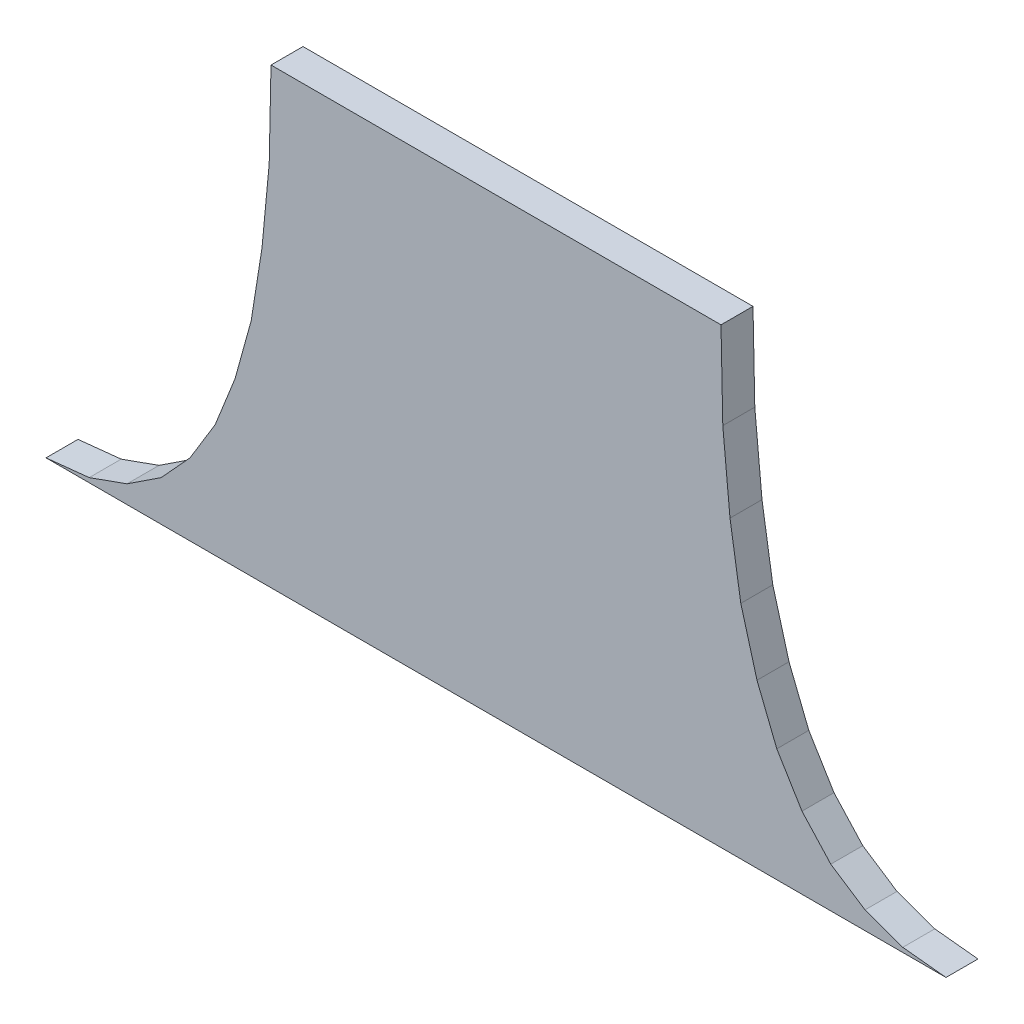
ISO-10303-21;
HEADER;
FILE_DESCRIPTION(('STEP AP214'),'2;1');
FILE_NAME('part.step','',(''),(''),'','','');
FILE_SCHEMA(('AUTOMOTIVE_DESIGN { 1 0 10303 214 1 1 1 1 }'));
ENDSEC;
DATA;
#1=APPLICATION_CONTEXT('core data for automotive mechanical design processes');
#2=APPLICATION_PROTOCOL_DEFINITION('international standard','automotive_design',2000,#1);
#3=PRODUCT_CONTEXT('',#1,'mechanical');
#4=PRODUCT('Part','Part','',(#3));
#5=PRODUCT_RELATED_PRODUCT_CATEGORY('part','',(#4));
#6=PRODUCT_DEFINITION_FORMATION('','',#4);
#7=PRODUCT_DEFINITION_CONTEXT('part definition',#1,'design');
#8=PRODUCT_DEFINITION('design','',#6,#7);
#9=PRODUCT_DEFINITION_SHAPE('','',#8);
#10=(LENGTH_UNIT() NAMED_UNIT(*) SI_UNIT(.MILLI.,.METRE.));
#11=(NAMED_UNIT(*) PLANE_ANGLE_UNIT() SI_UNIT($,.RADIAN.));
#12=(NAMED_UNIT(*) SI_UNIT($,.STERADIAN.) SOLID_ANGLE_UNIT());
#13=UNCERTAINTY_MEASURE_WITH_UNIT(LENGTH_MEASURE(1.E-05),#10,'distance_accuracy_value','');
#14=(GEOMETRIC_REPRESENTATION_CONTEXT(3) GLOBAL_UNCERTAINTY_ASSIGNED_CONTEXT((#13)) GLOBAL_UNIT_ASSIGNED_CONTEXT((#10,
#11,#12)) REPRESENTATION_CONTEXT('',''));
#15=CARTESIAN_POINT('',(0.,0.,0.));
#16=DIRECTION('',(0.,0.,1.));
#17=DIRECTION('',(1.,0.,0.));
#18=AXIS2_PLACEMENT_3D('',#15,#16,#17);
#19=CARTESIAN_POINT('',(33.6500015258789,102.387001037598,0.));
#20=DIRECTION('',(0.999782470330141,-0.0208569417834906,0.));
#21=DIRECTION('',(-0.0208569417834906,-0.999782470330141,0.));
#22=AXIS2_PLACEMENT_3D('',#19,#20,#21);
#23=PLANE('',#22);
#24=DIRECTION('',(-0.0208569417834906,-0.999782470330141,0.));
#25=VECTOR('',#24,1.);
#26=CARTESIAN_POINT('',(33.6500015258789,102.387001037598,0.03556));
#27=LINE('',#26,#25);
#28=CARTESIAN_POINT('',(33.6500015258789,102.387001037598,0.03556));
#29=VERTEX_POINT('',#28);
#30=CARTESIAN_POINT('',(33.6479988098145,102.291000366211,0.03556));
#31=VERTEX_POINT('',#30);
#32=EDGE_CURVE('E11',#29,#31,#27,.T.);
#33=ORIENTED_EDGE('',*,*,#32,.F.);
#34=DIRECTION('',(0.,0.,1.));
#35=VECTOR('',#34,1.);
#36=CARTESIAN_POINT('',(33.6500015258789,102.387001037598,0.));
#37=LINE('',#36,#35);
#38=CARTESIAN_POINT('',(33.6500015258789,102.387001037598,0.));
#39=VERTEX_POINT('',#38);
#40=EDGE_CURVE('E24',#39,#29,#37,.T.);
#41=ORIENTED_EDGE('',*,*,#40,.F.);
#42=DIRECTION('',(-0.0208569417834906,-0.999782470330141,0.));
#43=VECTOR('',#42,1.);
#44=CARTESIAN_POINT('',(33.6500015258789,102.387001037598,0.));
#45=LINE('',#44,#43);
#46=CARTESIAN_POINT('',(33.6479988098145,102.291000366211,0.));
#47=VERTEX_POINT('',#46);
#48=EDGE_CURVE('E184',#39,#47,#45,.T.);
#49=ORIENTED_EDGE('',*,*,#48,.T.);
#50=DIRECTION('',(0.,0.,1.));
#51=VECTOR('',#50,1.);
#52=CARTESIAN_POINT('',(33.6479988098145,102.291000366211,0.));
#53=LINE('',#52,#51);
#54=EDGE_CURVE('E37',#47,#31,#53,.T.);
#55=ORIENTED_EDGE('',*,*,#54,.T.);
#56=EDGE_LOOP('',(#33,#41,#49,#55));
#57=FACE_BOUND('',#56,.T.);
#58=ADVANCED_FACE('F17',(#57),#23,.F.);
#59=CARTESIAN_POINT('',(33.6479988098145,102.291000366211,0.));
#60=DIRECTION('',(0.995600683079774,-0.0936978113463013,0.));
#61=DIRECTION('',(-0.0936978113463013,-0.995600683079774,0.));
#62=AXIS2_PLACEMENT_3D('',#59,#60,#61);
#63=PLANE('',#62);
#64=DIRECTION('',(-0.0936978113463013,-0.995600683079774,0.));
#65=VECTOR('',#64,1.);
#66=CARTESIAN_POINT('',(33.6479988098145,102.291000366211,0.03556));
#67=LINE('',#66,#65);
#68=CARTESIAN_POINT('',(33.6399993896484,102.206001281738,0.03556));
#69=VERTEX_POINT('',#68);
#70=EDGE_CURVE('E336',#31,#69,#67,.T.);
#71=ORIENTED_EDGE('',*,*,#70,.F.);
#72=ORIENTED_EDGE('',*,*,#54,.F.);
#73=DIRECTION('',(-0.0936978113463013,-0.995600683079774,0.));
#74=VECTOR('',#73,1.);
#75=CARTESIAN_POINT('',(33.6479988098145,102.291000366211,0.));
#76=LINE('',#75,#74);
#77=CARTESIAN_POINT('',(33.6399993896484,102.206001281738,0.));
#78=VERTEX_POINT('',#77);
#79=EDGE_CURVE('E333',#47,#78,#76,.T.);
#80=ORIENTED_EDGE('',*,*,#79,.T.);
#81=DIRECTION('',(0.,0.,1.));
#82=VECTOR('',#81,1.);
#83=CARTESIAN_POINT('',(33.6399993896484,102.206001281738,0.));
#84=LINE('',#83,#82);
#85=EDGE_CURVE('E331',#78,#69,#84,.T.);
#86=ORIENTED_EDGE('',*,*,#85,.T.);
#87=EDGE_LOOP('',(#71,#72,#80,#86));
#88=FACE_BOUND('',#87,.T.);
#89=ADVANCED_FACE('F344',(#88),#63,.F.);
#90=CARTESIAN_POINT('',(33.6399993896484,102.206001281738,0.));
#91=DIRECTION('',(0.987762161372723,-0.155967665111353,0.));
#92=DIRECTION('',(-0.155967665111353,-0.987762161372723,0.));
#93=AXIS2_PLACEMENT_3D('',#90,#91,#92);
#94=PLANE('',#93);
#95=DIRECTION('',(-0.155967665111353,-0.987762161372723,0.));
#96=VECTOR('',#95,1.);
#97=CARTESIAN_POINT('',(33.6399993896484,102.206001281738,0.03556));
#98=LINE('',#97,#96);
#99=CARTESIAN_POINT('',(33.6279983520508,102.129997253418,0.03556));
#100=VERTEX_POINT('',#99);
#101=EDGE_CURVE('E328',#69,#100,#98,.T.);
#102=ORIENTED_EDGE('',*,*,#101,.F.);
#103=ORIENTED_EDGE('',*,*,#85,.F.);
#104=DIRECTION('',(-0.155967665111353,-0.987762161372723,0.));
#105=VECTOR('',#104,1.);
#106=CARTESIAN_POINT('',(33.6399993896484,102.206001281738,0.));
#107=LINE('',#106,#105);
#108=CARTESIAN_POINT('',(33.6279983520508,102.129997253418,0.));
#109=VERTEX_POINT('',#108);
#110=EDGE_CURVE('E325',#78,#109,#107,.T.);
#111=ORIENTED_EDGE('',*,*,#110,.T.);
#112=DIRECTION('',(0.,0.,1.));
#113=VECTOR('',#112,1.);
#114=CARTESIAN_POINT('',(33.6279983520508,102.129997253418,0.));
#115=LINE('',#114,#113);
#116=EDGE_CURVE('E323',#109,#100,#115,.T.);
#117=ORIENTED_EDGE('',*,*,#116,.T.);
#118=EDGE_LOOP('',(#102,#103,#111,#117));
#119=FACE_BOUND('',#118,.T.);
#120=ADVANCED_FACE('F350',(#119),#94,.F.);
#121=CARTESIAN_POINT('',(33.6279983520508,102.129997253418,0.));
#122=DIRECTION('',(0.963733155260729,-0.266867767726266,0.));
#123=DIRECTION('',(-0.266867767726266,-0.963733155260729,0.));
#124=AXIS2_PLACEMENT_3D('',#121,#122,#123);
#125=PLANE('',#124);
#126=DIRECTION('',(-0.266867767726266,-0.963733155260729,0.));
#127=VECTOR('',#126,1.);
#128=CARTESIAN_POINT('',(33.6279983520508,102.129997253418,0.03556));
#129=LINE('',#128,#127);
#130=CARTESIAN_POINT('',(33.6100006103516,102.065002441406,0.03556));
#131=VERTEX_POINT('',#130);
#132=EDGE_CURVE('E320',#100,#131,#129,.T.);
#133=ORIENTED_EDGE('',*,*,#132,.F.);
#134=ORIENTED_EDGE('',*,*,#116,.F.);
#135=DIRECTION('',(-0.266867767726266,-0.963733155260729,0.));
#136=VECTOR('',#135,1.);
#137=CARTESIAN_POINT('',(33.6279983520508,102.129997253418,0.));
#138=LINE('',#137,#136);
#139=CARTESIAN_POINT('',(33.6100006103516,102.065002441406,0.));
#140=VERTEX_POINT('',#139);
#141=EDGE_CURVE('E317',#109,#140,#138,.T.);
#142=ORIENTED_EDGE('',*,*,#141,.T.);
#143=DIRECTION('',(0.,0.,1.));
#144=VECTOR('',#143,1.);
#145=CARTESIAN_POINT('',(33.6100006103516,102.065002441406,0.));
#146=LINE('',#145,#144);
#147=EDGE_CURVE('E315',#140,#131,#146,.T.);
#148=ORIENTED_EDGE('',*,*,#147,.T.);
#149=EDGE_LOOP('',(#133,#134,#142,#148));
#150=FACE_BOUND('',#149,.T.);
#151=ADVANCED_FACE('F352',(#150),#125,.F.);
#152=CARTESIAN_POINT('',(33.6100006103516,102.065002441406,0.));
#153=DIRECTION('',(0.928481132016093,-0.371379573334499,0.));
#154=DIRECTION('',(-0.371379573334499,-0.928481132016093,0.));
#155=AXIS2_PLACEMENT_3D('',#152,#153,#154);
#156=PLANE('',#155);
#157=DIRECTION('',(-0.371379573334499,-0.928481132016093,0.));
#158=VECTOR('',#157,1.);
#159=CARTESIAN_POINT('',(33.6100006103516,102.065002441406,0.03556));
#160=LINE('',#159,#158);
#161=CARTESIAN_POINT('',(33.5880012512207,102.01000213623,0.03556));
#162=VERTEX_POINT('',#161);
#163=EDGE_CURVE('E312',#131,#162,#160,.T.);
#164=ORIENTED_EDGE('',*,*,#163,.F.);
#165=ORIENTED_EDGE('',*,*,#147,.F.);
#166=DIRECTION('',(-0.371379573334499,-0.928481132016093,0.));
#167=VECTOR('',#166,1.);
#168=CARTESIAN_POINT('',(33.6100006103516,102.065002441406,0.));
#169=LINE('',#168,#167);
#170=CARTESIAN_POINT('',(33.5880012512207,102.01000213623,0.));
#171=VERTEX_POINT('',#170);
#172=EDGE_CURVE('E309',#140,#171,#169,.T.);
#173=ORIENTED_EDGE('',*,*,#172,.T.);
#174=DIRECTION('',(0.,0.,1.));
#175=VECTOR('',#174,1.);
#176=CARTESIAN_POINT('',(33.5880012512207,102.01000213623,0.));
#177=LINE('',#176,#175);
#178=EDGE_CURVE('E307',#171,#162,#177,.T.);
#179=ORIENTED_EDGE('',*,*,#178,.T.);
#180=EDGE_LOOP('',(#164,#165,#173,#179));
#181=FACE_BOUND('',#180,.T.);
#182=ADVANCED_FACE('F357',(#181),#156,.F.);
#183=CARTESIAN_POINT('',(33.5880012512207,102.01000213623,0.));
#184=DIRECTION('',(0.854225909982595,-0.51990200491478,0.));
#185=DIRECTION('',(-0.51990200491478,-0.854225909982595,0.));
#186=AXIS2_PLACEMENT_3D('',#183,#184,#185);
#187=PLANE('',#186);
#188=DIRECTION('',(-0.51990200491478,-0.854225909982595,0.));
#189=VECTOR('',#188,1.);
#190=CARTESIAN_POINT('',(33.5880012512207,102.01000213623,0.03556));
#191=LINE('',#190,#189);
#192=CARTESIAN_POINT('',(33.560001373291,101.963996887207,0.03556));
#193=VERTEX_POINT('',#192);
#194=EDGE_CURVE('E304',#162,#193,#191,.T.);
#195=ORIENTED_EDGE('',*,*,#194,.F.);
#196=ORIENTED_EDGE('',*,*,#178,.F.);
#197=DIRECTION('',(-0.51990200491478,-0.854225909982595,0.));
#198=VECTOR('',#197,1.);
#199=CARTESIAN_POINT('',(33.5880012512207,102.01000213623,0.));
#200=LINE('',#199,#198);
#201=CARTESIAN_POINT('',(33.560001373291,101.963996887207,0.));
#202=VERTEX_POINT('',#201);
#203=EDGE_CURVE('E301',#171,#202,#200,.T.);
#204=ORIENTED_EDGE('',*,*,#203,.T.);
#205=DIRECTION('',(0.,0.,1.));
#206=VECTOR('',#205,1.);
#207=CARTESIAN_POINT('',(33.560001373291,101.963996887207,0.));
#208=LINE('',#207,#206);
#209=EDGE_CURVE('E299',#202,#193,#208,.T.);
#210=ORIENTED_EDGE('',*,*,#209,.T.);
#211=EDGE_LOOP('',(#195,#196,#204,#210));
#212=FACE_BOUND('',#211,.T.);
#213=ADVANCED_FACE('F360',(#212),#187,.F.);
#214=CARTESIAN_POINT('',(33.560001373291,101.963996887207,0.));
#215=DIRECTION('',(0.737975014732249,-0.674828035599394,0.));
#216=DIRECTION('',(-0.674828035599394,-0.737975014732249,0.));
#217=AXIS2_PLACEMENT_3D('',#214,#215,#216);
#218=PLANE('',#217);
#219=DIRECTION('',(-0.674828035599394,-0.737975014732249,0.));
#220=VECTOR('',#219,1.);
#221=CARTESIAN_POINT('',(33.560001373291,101.963996887207,0.03556));
#222=LINE('',#221,#220);
#223=CARTESIAN_POINT('',(33.5279998779297,101.929000854492,0.03556));
#224=VERTEX_POINT('',#223);
#225=EDGE_CURVE('E296',#193,#224,#222,.T.);
#226=ORIENTED_EDGE('',*,*,#225,.F.);
#227=ORIENTED_EDGE('',*,*,#209,.F.);
#228=DIRECTION('',(-0.674828035599394,-0.737975014732249,0.));
#229=VECTOR('',#228,1.);
#230=CARTESIAN_POINT('',(33.560001373291,101.963996887207,0.));
#231=LINE('',#230,#229);
#232=CARTESIAN_POINT('',(33.5279998779297,101.929000854492,0.));
#233=VERTEX_POINT('',#232);
#234=EDGE_CURVE('E293',#202,#233,#231,.T.);
#235=ORIENTED_EDGE('',*,*,#234,.T.);
#236=DIRECTION('',(0.,0.,1.));
#237=VECTOR('',#236,1.);
#238=CARTESIAN_POINT('',(33.5279998779297,101.929000854492,0.));
#239=LINE('',#238,#237);
#240=EDGE_CURVE('E291',#233,#224,#239,.T.);
#241=ORIENTED_EDGE('',*,*,#240,.T.);
#242=EDGE_LOOP('',(#226,#227,#235,#241));
#243=FACE_BOUND('',#242,.T.);
#244=ADVANCED_FACE('F365',(#243),#218,.F.);
#245=CARTESIAN_POINT('',(33.5279998779297,101.929000854492,0.));
#246=DIRECTION('',(0.549658089276112,-0.83538972036609,0.));
#247=DIRECTION('',(-0.83538972036609,-0.549658089276112,0.));
#248=AXIS2_PLACEMENT_3D('',#245,#246,#247);
#249=PLANE('',#248);
#250=DIRECTION('',(-0.83538972036609,-0.549658089276112,0.));
#251=VECTOR('',#250,1.);
#252=CARTESIAN_POINT('',(33.5279998779297,101.929000854492,0.03556));
#253=LINE('',#252,#251);
#254=CARTESIAN_POINT('',(33.4900016784668,101.903999328613,0.03556));
#255=VERTEX_POINT('',#254);
#256=EDGE_CURVE('E288',#224,#255,#253,.T.);
#257=ORIENTED_EDGE('',*,*,#256,.F.);
#258=ORIENTED_EDGE('',*,*,#240,.F.);
#259=DIRECTION('',(-0.83538972036609,-0.549658089276112,0.));
#260=VECTOR('',#259,1.);
#261=CARTESIAN_POINT('',(33.5279998779297,101.929000854492,0.));
#262=LINE('',#261,#260);
#263=CARTESIAN_POINT('',(33.4900016784668,101.903999328613,0.));
#264=VERTEX_POINT('',#263);
#265=EDGE_CURVE('E285',#233,#264,#262,.T.);
#266=ORIENTED_EDGE('',*,*,#265,.T.);
#267=DIRECTION('',(0.,0.,1.));
#268=VECTOR('',#267,1.);
#269=CARTESIAN_POINT('',(33.4900016784668,101.903999328613,0.));
#270=LINE('',#269,#268);
#271=EDGE_CURVE('E283',#264,#255,#270,.T.);
#272=ORIENTED_EDGE('',*,*,#271,.T.);
#273=EDGE_LOOP('',(#257,#258,#266,#272));
#274=FACE_BOUND('',#273,.T.);
#275=ADVANCED_FACE('F368',(#274),#249,.F.);
#276=CARTESIAN_POINT('',(33.4900016784668,101.903999328613,0.));
#277=DIRECTION('',(0.336325559899805,-0.941745781916799,0.));
#278=DIRECTION('',(-0.941745781916799,-0.336325559899805,0.));
#279=AXIS2_PLACEMENT_3D('',#276,#277,#278);
#280=PLANE('',#279);
#281=DIRECTION('',(-0.941745781916799,-0.336325559899805,0.));
#282=VECTOR('',#281,1.);
#283=CARTESIAN_POINT('',(33.4900016784668,101.903999328613,0.03556));
#284=LINE('',#283,#282);
#285=CARTESIAN_POINT('',(33.4480018615723,101.888999938965,0.03556));
#286=VERTEX_POINT('',#285);
#287=EDGE_CURVE('E280',#255,#286,#284,.T.);
#288=ORIENTED_EDGE('',*,*,#287,.F.);
#289=ORIENTED_EDGE('',*,*,#271,.F.);
#290=DIRECTION('',(-0.941745781916799,-0.336325559899805,0.));
#291=VECTOR('',#290,1.);
#292=CARTESIAN_POINT('',(33.4900016784668,101.903999328613,0.));
#293=LINE('',#292,#291);
#294=CARTESIAN_POINT('',(33.4480018615723,101.888999938965,0.));
#295=VERTEX_POINT('',#294);
#296=EDGE_CURVE('E277',#264,#295,#293,.T.);
#297=ORIENTED_EDGE('',*,*,#296,.T.);
#298=DIRECTION('',(0.,0.,1.));
#299=VECTOR('',#298,1.);
#300=CARTESIAN_POINT('',(33.4480018615723,101.888999938965,0.));
#301=LINE('',#300,#299);
#302=EDGE_CURVE('E275',#295,#286,#301,.T.);
#303=ORIENTED_EDGE('',*,*,#302,.T.);
#304=EDGE_LOOP('',(#288,#289,#297,#303));
#305=FACE_BOUND('',#304,.T.);
#306=ADVANCED_FACE('F373',(#305),#280,.F.);
#307=CARTESIAN_POINT('',(33.4480018615723,101.888999938965,0.));
#308=DIRECTION('',(0.103549065734372,-0.994624346668399,0.));
#309=DIRECTION('',(-0.994624346668399,-0.103549065734372,0.));
#310=AXIS2_PLACEMENT_3D('',#307,#308,#309);
#311=PLANE('',#310);
#312=DIRECTION('',(-0.994624346668399,-0.103549065734372,0.));
#313=VECTOR('',#312,1.);
#314=CARTESIAN_POINT('',(33.4480018615723,101.888999938965,0.03556));
#315=LINE('',#314,#313);
#316=CARTESIAN_POINT('',(33.4000015258789,101.884002685547,0.03556));
#317=VERTEX_POINT('',#316);
#318=EDGE_CURVE('E272',#286,#317,#315,.T.);
#319=ORIENTED_EDGE('',*,*,#318,.F.);
#320=ORIENTED_EDGE('',*,*,#302,.F.);
#321=DIRECTION('',(-0.994624346668399,-0.103549065734372,0.));
#322=VECTOR('',#321,1.);
#323=CARTESIAN_POINT('',(33.4480018615723,101.888999938965,0.));
#324=LINE('',#323,#322);
#325=CARTESIAN_POINT('',(33.4000015258789,101.884002685547,0.));
#326=VERTEX_POINT('',#325);
#327=EDGE_CURVE('E269',#295,#326,#324,.T.);
#328=ORIENTED_EDGE('',*,*,#327,.T.);
#329=DIRECTION('',(0.,0.,1.));
#330=VECTOR('',#329,1.);
#331=CARTESIAN_POINT('',(33.4000015258789,101.884002685547,0.));
#332=LINE('',#331,#330);
#333=EDGE_CURVE('E267',#326,#317,#332,.T.);
#334=ORIENTED_EDGE('',*,*,#333,.T.);
#335=EDGE_LOOP('',(#319,#320,#328,#334));
#336=FACE_BOUND('',#335,.T.);
#337=ADVANCED_FACE('F376',(#336),#311,.F.);
#338=CARTESIAN_POINT('',(33.4000015258789,101.884002685547,0.));
#339=DIRECTION('',(0.,1.,0.));
#340=DIRECTION('',(1.,0.,0.));
#341=AXIS2_PLACEMENT_3D('',#338,#339,#340);
#342=PLANE('',#341);
#343=DIRECTION('',(1.,0.,0.));
#344=VECTOR('',#343,1.);
#345=CARTESIAN_POINT('',(33.4000015258789,101.884002685547,0.03556));
#346=LINE('',#345,#344);
#347=CARTESIAN_POINT('',(34.4000015258789,101.884002685547,0.03556));
#348=VERTEX_POINT('',#347);
#349=EDGE_CURVE('E264',#317,#348,#346,.T.);
#350=ORIENTED_EDGE('',*,*,#349,.F.);
#351=ORIENTED_EDGE('',*,*,#333,.F.);
#352=DIRECTION('',(1.,0.,0.));
#353=VECTOR('',#352,1.);
#354=CARTESIAN_POINT('',(33.4000015258789,101.884002685547,0.));
#355=LINE('',#354,#353);
#356=CARTESIAN_POINT('',(34.4000015258789,101.884002685547,0.));
#357=VERTEX_POINT('',#356);
#358=EDGE_CURVE('E261',#326,#357,#355,.T.);
#359=ORIENTED_EDGE('',*,*,#358,.T.);
#360=DIRECTION('',(0.,0.,1.));
#361=VECTOR('',#360,1.);
#362=CARTESIAN_POINT('',(34.4000015258789,101.884002685547,0.));
#363=LINE('',#362,#361);
#364=EDGE_CURVE('E259',#357,#348,#363,.T.);
#365=ORIENTED_EDGE('',*,*,#364,.T.);
#366=EDGE_LOOP('',(#350,#351,#359,#365));
#367=FACE_BOUND('',#366,.T.);
#368=ADVANCED_FACE('F381',(#367),#342,.F.);
#369=CARTESIAN_POINT('',(34.4000015258789,101.884002685547,0.));
#370=DIRECTION('',(-0.103549065734372,-0.994624346668399,0.));
#371=DIRECTION('',(-0.994624346668399,0.103549065734372,0.));
#372=AXIS2_PLACEMENT_3D('',#369,#370,#371);
#373=PLANE('',#372);
#374=DIRECTION('',(-0.994624346668399,0.103549065734372,0.));
#375=VECTOR('',#374,1.);
#376=CARTESIAN_POINT('',(34.4000015258789,101.884002685547,0.03556));
#377=LINE('',#376,#375);
#378=CARTESIAN_POINT('',(34.3520011901855,101.888999938965,0.03556));
#379=VERTEX_POINT('',#378);
#380=EDGE_CURVE('E256',#348,#379,#377,.T.);
#381=ORIENTED_EDGE('',*,*,#380,.F.);
#382=ORIENTED_EDGE('',*,*,#364,.F.);
#383=DIRECTION('',(-0.994624346668399,0.103549065734372,0.));
#384=VECTOR('',#383,1.);
#385=CARTESIAN_POINT('',(34.4000015258789,101.884002685547,0.));
#386=LINE('',#385,#384);
#387=CARTESIAN_POINT('',(34.3520011901855,101.888999938965,0.));
#388=VERTEX_POINT('',#387);
#389=EDGE_CURVE('E253',#357,#388,#386,.T.);
#390=ORIENTED_EDGE('',*,*,#389,.T.);
#391=DIRECTION('',(0.,0.,1.));
#392=VECTOR('',#391,1.);
#393=CARTESIAN_POINT('',(34.3520011901855,101.888999938965,0.));
#394=LINE('',#393,#392);
#395=EDGE_CURVE('E251',#388,#379,#394,.T.);
#396=ORIENTED_EDGE('',*,*,#395,.T.);
#397=EDGE_LOOP('',(#381,#382,#390,#396));
#398=FACE_BOUND('',#397,.T.);
#399=ADVANCED_FACE('F384',(#398),#373,.F.);
#400=CARTESIAN_POINT('',(34.3520011901855,101.888999938965,0.));
#401=DIRECTION('',(-0.336325559899805,-0.941745781916799,0.));
#402=DIRECTION('',(-0.941745781916799,0.336325559899805,0.));
#403=AXIS2_PLACEMENT_3D('',#400,#401,#402);
#404=PLANE('',#403);
#405=DIRECTION('',(-0.941745781916799,0.336325559899805,0.));
#406=VECTOR('',#405,1.);
#407=CARTESIAN_POINT('',(34.3520011901855,101.888999938965,0.03556));
#408=LINE('',#407,#406);
#409=CARTESIAN_POINT('',(34.310001373291,101.903999328613,0.03556));
#410=VERTEX_POINT('',#409);
#411=EDGE_CURVE('E248',#379,#410,#408,.T.);
#412=ORIENTED_EDGE('',*,*,#411,.F.);
#413=ORIENTED_EDGE('',*,*,#395,.F.);
#414=DIRECTION('',(-0.941745781916799,0.336325559899805,0.));
#415=VECTOR('',#414,1.);
#416=CARTESIAN_POINT('',(34.3520011901855,101.888999938965,0.));
#417=LINE('',#416,#415);
#418=CARTESIAN_POINT('',(34.310001373291,101.903999328613,0.));
#419=VERTEX_POINT('',#418);
#420=EDGE_CURVE('E245',#388,#419,#417,.T.);
#421=ORIENTED_EDGE('',*,*,#420,.T.);
#422=DIRECTION('',(0.,0.,1.));
#423=VECTOR('',#422,1.);
#424=CARTESIAN_POINT('',(34.310001373291,101.903999328613,0.));
#425=LINE('',#424,#423);
#426=EDGE_CURVE('E243',#419,#410,#425,.T.);
#427=ORIENTED_EDGE('',*,*,#426,.T.);
#428=EDGE_LOOP('',(#412,#413,#421,#427));
#429=FACE_BOUND('',#428,.T.);
#430=ADVANCED_FACE('F389',(#429),#404,.F.);
#431=CARTESIAN_POINT('',(34.310001373291,101.903999328613,0.));
#432=DIRECTION('',(-0.549619581884933,-0.83541505565116,0.));
#433=DIRECTION('',(-0.83541505565116,0.549619581884933,0.));
#434=AXIS2_PLACEMENT_3D('',#431,#432,#433);
#435=PLANE('',#434);
#436=DIRECTION('',(-0.83541505565116,0.549619581884933,0.));
#437=VECTOR('',#436,1.);
#438=CARTESIAN_POINT('',(34.310001373291,101.903999328613,0.03556));
#439=LINE('',#438,#437);
#440=CARTESIAN_POINT('',(34.2719993591309,101.929000854492,0.03556));
#441=VERTEX_POINT('',#440);
#442=EDGE_CURVE('E240',#410,#441,#439,.T.);
#443=ORIENTED_EDGE('',*,*,#442,.F.);
#444=ORIENTED_EDGE('',*,*,#426,.F.);
#445=DIRECTION('',(-0.83541505565116,0.549619581884933,0.));
#446=VECTOR('',#445,1.);
#447=CARTESIAN_POINT('',(34.310001373291,101.903999328613,0.));
#448=LINE('',#447,#446);
#449=CARTESIAN_POINT('',(34.2719993591309,101.929000854492,0.));
#450=VERTEX_POINT('',#449);
#451=EDGE_CURVE('E237',#419,#450,#448,.T.);
#452=ORIENTED_EDGE('',*,*,#451,.T.);
#453=DIRECTION('',(0.,0.,1.));
#454=VECTOR('',#453,1.);
#455=CARTESIAN_POINT('',(34.2719993591309,101.929000854492,0.));
#456=LINE('',#455,#454);
#457=EDGE_CURVE('E235',#450,#441,#456,.T.);
#458=ORIENTED_EDGE('',*,*,#457,.T.);
#459=EDGE_LOOP('',(#443,#444,#452,#458));
#460=FACE_BOUND('',#459,.T.);
#461=ADVANCED_FACE('F392',(#460),#435,.F.);
#462=CARTESIAN_POINT('',(34.2719993591309,101.929000854492,0.));
#463=DIRECTION('',(-0.738015076229384,-0.674784222739489,0.));
#464=DIRECTION('',(-0.674784222739489,0.738015076229384,0.));
#465=AXIS2_PLACEMENT_3D('',#462,#463,#464);
#466=PLANE('',#465);
#467=DIRECTION('',(-0.674784222739489,0.738015076229384,0.));
#468=VECTOR('',#467,1.);
#469=CARTESIAN_POINT('',(34.2719993591309,101.929000854492,0.03556));
#470=LINE('',#469,#468);
#471=CARTESIAN_POINT('',(34.2400016784668,101.963996887207,0.03556));
#472=VERTEX_POINT('',#471);
#473=EDGE_CURVE('E232',#441,#472,#470,.T.);
#474=ORIENTED_EDGE('',*,*,#473,.F.);
#475=ORIENTED_EDGE('',*,*,#457,.F.);
#476=DIRECTION('',(-0.674784222739489,0.738015076229384,0.));
#477=VECTOR('',#476,1.);
#478=CARTESIAN_POINT('',(34.2719993591309,101.929000854492,0.));
#479=LINE('',#478,#477);
#480=CARTESIAN_POINT('',(34.2400016784668,101.963996887207,0.));
#481=VERTEX_POINT('',#480);
#482=EDGE_CURVE('E229',#450,#481,#479,.T.);
#483=ORIENTED_EDGE('',*,*,#482,.T.);
#484=DIRECTION('',(0.,0.,1.));
#485=VECTOR('',#484,1.);
#486=CARTESIAN_POINT('',(34.2400016784668,101.963996887207,0.));
#487=LINE('',#486,#485);
#488=EDGE_CURVE('E227',#481,#472,#487,.T.);
#489=ORIENTED_EDGE('',*,*,#488,.T.);
#490=EDGE_LOOP('',(#474,#475,#483,#489));
#491=FACE_BOUND('',#490,.T.);
#492=ADVANCED_FACE('F397',(#491),#466,.F.);
#493=CARTESIAN_POINT('',(34.2400016784668,101.963996887207,0.));
#494=DIRECTION('',(-0.854225909982595,-0.51990200491478,0.));
#495=DIRECTION('',(-0.51990200491478,0.854225909982595,0.));
#496=AXIS2_PLACEMENT_3D('',#493,#494,#495);
#497=PLANE('',#496);
#498=DIRECTION('',(-0.51990200491478,0.854225909982595,0.));
#499=VECTOR('',#498,1.);
#500=CARTESIAN_POINT('',(34.2400016784668,101.963996887207,0.03556));
#501=LINE('',#500,#499);
#502=CARTESIAN_POINT('',(34.2120018005371,102.01000213623,0.03556));
#503=VERTEX_POINT('',#502);
#504=EDGE_CURVE('E224',#472,#503,#501,.T.);
#505=ORIENTED_EDGE('',*,*,#504,.F.);
#506=ORIENTED_EDGE('',*,*,#488,.F.);
#507=DIRECTION('',(-0.51990200491478,0.854225909982595,0.));
#508=VECTOR('',#507,1.);
#509=CARTESIAN_POINT('',(34.2400016784668,101.963996887207,0.));
#510=LINE('',#509,#508);
#511=CARTESIAN_POINT('',(34.2120018005371,102.01000213623,0.));
#512=VERTEX_POINT('',#511);
#513=EDGE_CURVE('E221',#481,#512,#510,.T.);
#514=ORIENTED_EDGE('',*,*,#513,.T.);
#515=DIRECTION('',(0.,0.,1.));
#516=VECTOR('',#515,1.);
#517=CARTESIAN_POINT('',(34.2120018005371,102.01000213623,0.));
#518=LINE('',#517,#516);
#519=EDGE_CURVE('E219',#512,#503,#518,.T.);
#520=ORIENTED_EDGE('',*,*,#519,.T.);
#521=EDGE_LOOP('',(#505,#506,#514,#520));
#522=FACE_BOUND('',#521,.T.);
#523=ADVANCED_FACE('F400',(#522),#497,.F.);
#524=CARTESIAN_POINT('',(34.2120018005371,102.01000213623,0.));
#525=DIRECTION('',(-0.92845892545913,-0.371435086839247,0.));
#526=DIRECTION('',(-0.371435086839247,0.92845892545913,0.));
#527=AXIS2_PLACEMENT_3D('',#524,#525,#526);
#528=PLANE('',#527);
#529=DIRECTION('',(-0.371435086839247,0.92845892545913,0.));
#530=VECTOR('',#529,1.);
#531=CARTESIAN_POINT('',(34.2120018005371,102.01000213623,0.03556));
#532=LINE('',#531,#530);
#533=CARTESIAN_POINT('',(34.189998626709,102.065002441406,0.03556));
#534=VERTEX_POINT('',#533);
#535=EDGE_CURVE('E216',#503,#534,#532,.T.);
#536=ORIENTED_EDGE('',*,*,#535,.F.);
#537=ORIENTED_EDGE('',*,*,#519,.F.);
#538=DIRECTION('',(-0.371435086839247,0.92845892545913,0.));
#539=VECTOR('',#538,1.);
#540=CARTESIAN_POINT('',(34.2120018005371,102.01000213623,0.));
#541=LINE('',#540,#539);
#542=CARTESIAN_POINT('',(34.189998626709,102.065002441406,0.));
#543=VERTEX_POINT('',#542);
#544=EDGE_CURVE('E213',#512,#543,#541,.T.);
#545=ORIENTED_EDGE('',*,*,#544,.T.);
#546=DIRECTION('',(0.,0.,1.));
#547=VECTOR('',#546,1.);
#548=CARTESIAN_POINT('',(34.189998626709,102.065002441406,0.));
#549=LINE('',#548,#547);
#550=EDGE_CURVE('E211',#543,#534,#549,.T.);
#551=ORIENTED_EDGE('',*,*,#550,.T.);
#552=EDGE_LOOP('',(#536,#537,#545,#551));
#553=FACE_BOUND('',#552,.T.);
#554=ADVANCED_FACE('F405',(#553),#528,.F.);
#555=CARTESIAN_POINT('',(34.189998626709,102.065002441406,0.));
#556=DIRECTION('',(-0.963733155260729,-0.266867767726266,0.));
#557=DIRECTION('',(-0.266867767726266,0.963733155260729,0.));
#558=AXIS2_PLACEMENT_3D('',#555,#556,#557);
#559=PLANE('',#558);
#560=DIRECTION('',(-0.266867767726266,0.963733155260729,0.));
#561=VECTOR('',#560,1.);
#562=CARTESIAN_POINT('',(34.189998626709,102.065002441406,0.03556));
#563=LINE('',#562,#561);
#564=CARTESIAN_POINT('',(34.1720008850098,102.129997253418,0.03556));
#565=VERTEX_POINT('',#564);
#566=EDGE_CURVE('E208',#534,#565,#563,.T.);
#567=ORIENTED_EDGE('',*,*,#566,.F.);
#568=ORIENTED_EDGE('',*,*,#550,.F.);
#569=DIRECTION('',(-0.266867767726266,0.963733155260729,0.));
#570=VECTOR('',#569,1.);
#571=CARTESIAN_POINT('',(34.189998626709,102.065002441406,0.));
#572=LINE('',#571,#570);
#573=CARTESIAN_POINT('',(34.1720008850098,102.129997253418,0.));
#574=VERTEX_POINT('',#573);
#575=EDGE_CURVE('E205',#543,#574,#572,.T.);
#576=ORIENTED_EDGE('',*,*,#575,.T.);
#577=DIRECTION('',(0.,0.,1.));
#578=VECTOR('',#577,1.);
#579=CARTESIAN_POINT('',(34.1720008850098,102.129997253418,0.));
#580=LINE('',#579,#578);
#581=EDGE_CURVE('E203',#574,#565,#580,.T.);
#582=ORIENTED_EDGE('',*,*,#581,.T.);
#583=EDGE_LOOP('',(#567,#568,#576,#582));
#584=FACE_BOUND('',#583,.T.);
#585=ADVANCED_FACE('F408',(#584),#559,.F.);
#586=CARTESIAN_POINT('',(34.1720008850098,102.129997253418,0.));
#587=DIRECTION('',(-0.987762161372723,-0.155967665111353,0.));
#588=DIRECTION('',(-0.155967665111353,0.987762161372723,0.));
#589=AXIS2_PLACEMENT_3D('',#586,#587,#588);
#590=PLANE('',#589);
#591=DIRECTION('',(-0.155967665111353,0.987762161372723,0.));
#592=VECTOR('',#591,1.);
#593=CARTESIAN_POINT('',(34.1720008850098,102.129997253418,0.03556));
#594=LINE('',#593,#592);
#595=CARTESIAN_POINT('',(34.1599998474121,102.206001281738,0.03556));
#596=VERTEX_POINT('',#595);
#597=EDGE_CURVE('E200',#565,#596,#594,.T.);
#598=ORIENTED_EDGE('',*,*,#597,.F.);
#599=ORIENTED_EDGE('',*,*,#581,.F.);
#600=DIRECTION('',(-0.155967665111353,0.987762161372723,0.));
#601=VECTOR('',#600,1.);
#602=CARTESIAN_POINT('',(34.1720008850098,102.129997253418,0.));
#603=LINE('',#602,#601);
#604=CARTESIAN_POINT('',(34.1599998474121,102.206001281738,0.));
#605=VERTEX_POINT('',#604);
#606=EDGE_CURVE('E197',#574,#605,#603,.T.);
#607=ORIENTED_EDGE('',*,*,#606,.T.);
#608=DIRECTION('',(0.,0.,1.));
#609=VECTOR('',#608,1.);
#610=CARTESIAN_POINT('',(34.1599998474121,102.206001281738,0.));
#611=LINE('',#610,#609);
#612=EDGE_CURVE('E195',#605,#596,#611,.T.);
#613=ORIENTED_EDGE('',*,*,#612,.T.);
#614=EDGE_LOOP('',(#598,#599,#607,#613));
#615=FACE_BOUND('',#614,.T.);
#616=ADVANCED_FACE('F413',(#615),#590,.F.);
#617=CARTESIAN_POINT('',(34.1599998474121,102.206001281738,0.));
#618=DIRECTION('',(-0.995600683079774,-0.0936978113463013,0.));
#619=DIRECTION('',(-0.0936978113463013,0.995600683079774,0.));
#620=AXIS2_PLACEMENT_3D('',#617,#618,#619);
#621=PLANE('',#620);
#622=DIRECTION('',(-0.0936978113463013,0.995600683079774,0.));
#623=VECTOR('',#622,1.);
#624=CARTESIAN_POINT('',(34.1599998474121,102.206001281738,0.03556));
#625=LINE('',#624,#623);
#626=CARTESIAN_POINT('',(34.1520004272461,102.291000366211,0.03556));
#627=VERTEX_POINT('',#626);
#628=EDGE_CURVE('E192',#596,#627,#625,.T.);
#629=ORIENTED_EDGE('',*,*,#628,.F.);
#630=ORIENTED_EDGE('',*,*,#612,.F.);
#631=DIRECTION('',(-0.0936978113463013,0.995600683079774,0.));
#632=VECTOR('',#631,1.);
#633=CARTESIAN_POINT('',(34.1599998474121,102.206001281738,0.));
#634=LINE('',#633,#632);
#635=CARTESIAN_POINT('',(34.1520004272461,102.291000366211,0.));
#636=VERTEX_POINT('',#635);
#637=EDGE_CURVE('E190',#605,#636,#634,.T.);
#638=ORIENTED_EDGE('',*,*,#637,.T.);
#639=DIRECTION('',(0.,0.,1.));
#640=VECTOR('',#639,1.);
#641=CARTESIAN_POINT('',(34.1520004272461,102.291000366211,0.));
#642=LINE('',#641,#640);
#643=EDGE_CURVE('E175',#636,#627,#642,.T.);
#644=ORIENTED_EDGE('',*,*,#643,.T.);
#645=EDGE_LOOP('',(#629,#630,#638,#644));
#646=FACE_BOUND('',#645,.T.);
#647=ADVANCED_FACE('F415',(#646),#621,.F.);
#648=CARTESIAN_POINT('',(34.1520004272461,102.291000366211,0.));
#649=DIRECTION('',(-0.999783297956284,-0.0208172315079509,0.));
#650=DIRECTION('',(-0.0208172315079509,0.999783297956284,0.));
#651=AXIS2_PLACEMENT_3D('',#648,#649,#650);
#652=PLANE('',#651);
#653=DIRECTION('',(-0.0208172315079509,0.999783297956284,0.));
#654=VECTOR('',#653,1.);
#655=CARTESIAN_POINT('',(34.1520004272461,102.291000366211,0.03556));
#656=LINE('',#655,#654);
#657=CARTESIAN_POINT('',(34.1500015258789,102.387001037598,0.03556));
#658=VERTEX_POINT('',#657);
#659=EDGE_CURVE('E179',#627,#658,#656,.T.);
#660=ORIENTED_EDGE('',*,*,#659,.F.);
#661=ORIENTED_EDGE('',*,*,#643,.F.);
#662=DIRECTION('',(-0.0208172315079509,0.999783297956284,0.));
#663=VECTOR('',#662,1.);
#664=CARTESIAN_POINT('',(34.1520004272461,102.291000366211,0.));
#665=LINE('',#664,#663);
#666=CARTESIAN_POINT('',(34.1500015258789,102.387001037598,0.));
#667=VERTEX_POINT('',#666);
#668=EDGE_CURVE('E171',#636,#667,#665,.T.);
#669=ORIENTED_EDGE('',*,*,#668,.T.);
#670=DIRECTION('',(0.,0.,1.));
#671=VECTOR('',#670,1.);
#672=CARTESIAN_POINT('',(34.1500015258789,102.387001037598,0.));
#673=LINE('',#672,#671);
#674=EDGE_CURVE('E161',#667,#658,#673,.T.);
#675=ORIENTED_EDGE('',*,*,#674,.T.);
#676=EDGE_LOOP('',(#660,#661,#669,#675));
#677=FACE_BOUND('',#676,.T.);
#678=ADVANCED_FACE('F174',(#677),#652,.F.);
#679=CARTESIAN_POINT('',(34.1500015258789,102.387001037598,0.));
#680=DIRECTION('',(0.,-1.,0.));
#681=DIRECTION('',(-1.,0.,0.));
#682=AXIS2_PLACEMENT_3D('',#679,#680,#681);
#683=PLANE('',#682);
#684=DIRECTION('',(-1.,0.,0.));
#685=VECTOR('',#684,1.);
#686=CARTESIAN_POINT('',(34.1500015258789,102.387001037598,0.03556));
#687=LINE('',#686,#685);
#688=EDGE_CURVE('E167',#658,#29,#687,.T.);
#689=ORIENTED_EDGE('',*,*,#688,.F.);
#690=ORIENTED_EDGE('',*,*,#674,.F.);
#691=DIRECTION('',(-1.,0.,0.));
#692=VECTOR('',#691,1.);
#693=CARTESIAN_POINT('',(34.1500015258789,102.387001037598,0.));
#694=LINE('',#693,#692);
#695=EDGE_CURVE('E165',#667,#39,#694,.T.);
#696=ORIENTED_EDGE('',*,*,#695,.T.);
#697=ORIENTED_EDGE('',*,*,#40,.T.);
#698=EDGE_LOOP('',(#689,#690,#696,#697));
#699=FACE_BOUND('',#698,.T.);
#700=ADVANCED_FACE('F163',(#699),#683,.F.);
#701=CARTESIAN_POINT('',(33.6500015258789,102.387001037598,0.));
#702=DIRECTION('',(0.,0.,1.));
#703=DIRECTION('',(1.,0.,0.));
#704=AXIS2_PLACEMENT_3D('',#701,#702,#703);
#705=PLANE('',#704);
#706=ORIENTED_EDGE('',*,*,#695,.F.);
#707=ORIENTED_EDGE('',*,*,#668,.F.);
#708=ORIENTED_EDGE('',*,*,#637,.F.);
#709=ORIENTED_EDGE('',*,*,#606,.F.);
#710=ORIENTED_EDGE('',*,*,#575,.F.);
#711=ORIENTED_EDGE('',*,*,#544,.F.);
#712=ORIENTED_EDGE('',*,*,#513,.F.);
#713=ORIENTED_EDGE('',*,*,#482,.F.);
#714=ORIENTED_EDGE('',*,*,#451,.F.);
#715=ORIENTED_EDGE('',*,*,#420,.F.);
#716=ORIENTED_EDGE('',*,*,#389,.F.);
#717=ORIENTED_EDGE('',*,*,#358,.F.);
#718=ORIENTED_EDGE('',*,*,#327,.F.);
#719=ORIENTED_EDGE('',*,*,#296,.F.);
#720=ORIENTED_EDGE('',*,*,#265,.F.);
#721=ORIENTED_EDGE('',*,*,#234,.F.);
#722=ORIENTED_EDGE('',*,*,#203,.F.);
#723=ORIENTED_EDGE('',*,*,#172,.F.);
#724=ORIENTED_EDGE('',*,*,#141,.F.);
#725=ORIENTED_EDGE('',*,*,#110,.F.);
#726=ORIENTED_EDGE('',*,*,#79,.F.);
#727=ORIENTED_EDGE('',*,*,#48,.F.);
#728=EDGE_LOOP('',(#706,#707,#708,#709,#710,#711,#712,#713,#714,#715,#716,#717,#718,#719,#720,
#721,#722,#723,#724,#725,#726,#727));
#729=FACE_BOUND('',#728,.T.);
#730=ADVANCED_FACE('F182',(#729),#705,.F.);
#731=CARTESIAN_POINT('',(33.6500015258789,102.387001037598,0.03556));
#732=DIRECTION('',(0.,0.,1.));
#733=DIRECTION('',(1.,0.,0.));
#734=AXIS2_PLACEMENT_3D('',#731,#732,#733);
#735=PLANE('',#734);
#736=ORIENTED_EDGE('',*,*,#32,.T.);
#737=ORIENTED_EDGE('',*,*,#70,.T.);
#738=ORIENTED_EDGE('',*,*,#101,.T.);
#739=ORIENTED_EDGE('',*,*,#132,.T.);
#740=ORIENTED_EDGE('',*,*,#163,.T.);
#741=ORIENTED_EDGE('',*,*,#194,.T.);
#742=ORIENTED_EDGE('',*,*,#225,.T.);
#743=ORIENTED_EDGE('',*,*,#256,.T.);
#744=ORIENTED_EDGE('',*,*,#287,.T.);
#745=ORIENTED_EDGE('',*,*,#318,.T.);
#746=ORIENTED_EDGE('',*,*,#349,.T.);
#747=ORIENTED_EDGE('',*,*,#380,.T.);
#748=ORIENTED_EDGE('',*,*,#411,.T.);
#749=ORIENTED_EDGE('',*,*,#442,.T.);
#750=ORIENTED_EDGE('',*,*,#473,.T.);
#751=ORIENTED_EDGE('',*,*,#504,.T.);
#752=ORIENTED_EDGE('',*,*,#535,.T.);
#753=ORIENTED_EDGE('',*,*,#566,.T.);
#754=ORIENTED_EDGE('',*,*,#597,.T.);
#755=ORIENTED_EDGE('',*,*,#628,.T.);
#756=ORIENTED_EDGE('',*,*,#659,.T.);
#757=ORIENTED_EDGE('',*,*,#688,.T.);
#758=EDGE_LOOP('',(#736,#737,#738,#739,#740,#741,#742,#743,#744,#745,#746,#747,#748,#749,#750,
#751,#752,#753,#754,#755,#756,#757));
#759=FACE_BOUND('',#758,.T.);
#760=ADVANCED_FACE('F347',(#759),#735,.T.);
#761=CLOSED_SHELL('',(#58,#89,#120,#151,#182,#213,#244,#275,#306,#337,#368,#399,#430,#461,#492,
#523,#554,#585,#616,#647,#678,#700,#730,#760));
#762=MANIFOLD_SOLID_BREP('B1',#761);
#763=ADVANCED_BREP_SHAPE_REPRESENTATION('',(#18,#762),#14);
#764=SHAPE_DEFINITION_REPRESENTATION(#9,#763);
ENDSEC;
END-ISO-10303-21;
